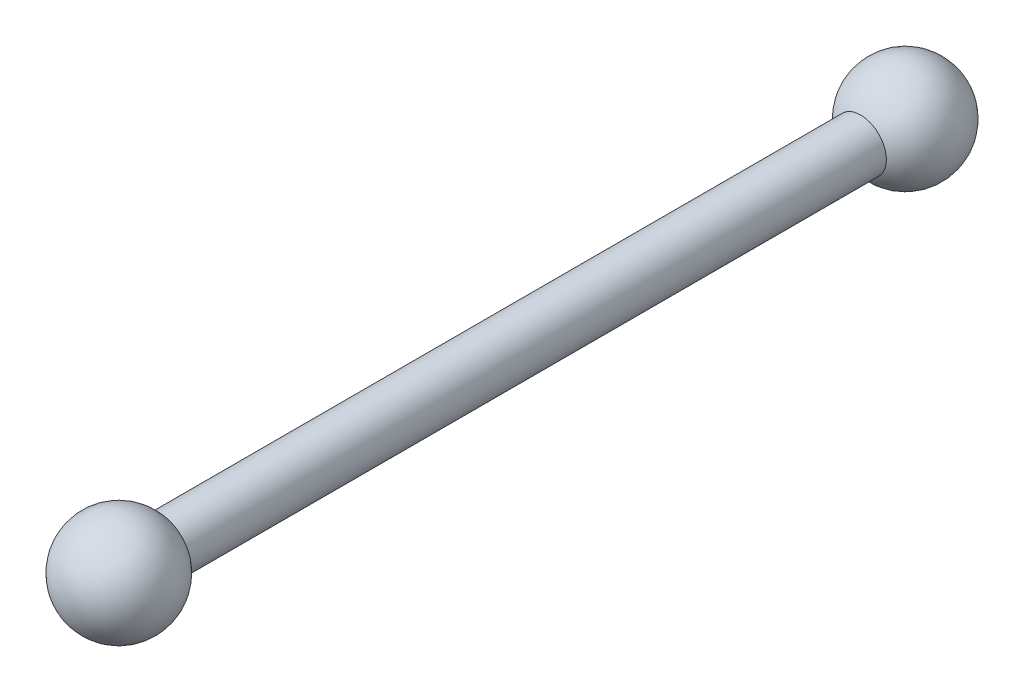
ISO-10303-21;
HEADER;
FILE_DESCRIPTION(('STEP AP214'),'2;1');
FILE_NAME('part.step','',(''),(''),'','','');
FILE_SCHEMA(('AUTOMOTIVE_DESIGN { 1 0 10303 214 1 1 1 1 }'));
ENDSEC;
DATA;
#1=APPLICATION_CONTEXT('core data for automotive mechanical design processes');
#2=APPLICATION_PROTOCOL_DEFINITION('international standard','automotive_design',2000,#1);
#3=PRODUCT_CONTEXT('',#1,'mechanical');
#4=PRODUCT('Part','Part','',(#3));
#5=PRODUCT_RELATED_PRODUCT_CATEGORY('part','',(#4));
#6=PRODUCT_DEFINITION_FORMATION('','',#4);
#7=PRODUCT_DEFINITION_CONTEXT('part definition',#1,'design');
#8=PRODUCT_DEFINITION('design','',#6,#7);
#9=PRODUCT_DEFINITION_SHAPE('','',#8);
#10=(LENGTH_UNIT() NAMED_UNIT(*) SI_UNIT(.MILLI.,.METRE.));
#11=(NAMED_UNIT(*) PLANE_ANGLE_UNIT() SI_UNIT($,.RADIAN.));
#12=(NAMED_UNIT(*) SI_UNIT($,.STERADIAN.) SOLID_ANGLE_UNIT());
#13=UNCERTAINTY_MEASURE_WITH_UNIT(LENGTH_MEASURE(1.E-05),#10,'distance_accuracy_value','');
#14=(GEOMETRIC_REPRESENTATION_CONTEXT(3) GLOBAL_UNCERTAINTY_ASSIGNED_CONTEXT((#13)) GLOBAL_UNIT_ASSIGNED_CONTEXT((#10,
#11,#12)) REPRESENTATION_CONTEXT('',''));
#15=CARTESIAN_POINT('',(0.,0.,0.));
#16=DIRECTION('',(0.,0.,1.));
#17=DIRECTION('',(1.,0.,0.));
#18=AXIS2_PLACEMENT_3D('',#15,#16,#17);
#19=CARTESIAN_POINT('',(0.,0.,-58.));
#20=DIRECTION('',(0.,1.,0.));
#21=DIRECTION('',(1.,0.,0.));
#22=AXIS2_PLACEMENT_3D('',#19,#20,#21);
#23=SPHERICAL_SURFACE('',#22,4.);
#24=CARTESIAN_POINT('',(0.,0.,-58.));
#25=DIRECTION('',(0.,0.,-1.));
#26=DIRECTION('',(-1.,0.,0.));
#27=AXIS2_PLACEMENT_3D('',#24,#25,#26);
#28=SPHERICAL_SURFACE('',#27,4.);
#29=CARTESIAN_POINT('',(0.,0.,-54.5358983848622));
#30=DIRECTION('',(0.,0.,-1.));
#31=DIRECTION('',(-1.,0.,0.));
#32=AXIS2_PLACEMENT_3D('',#29,#30,#31);
#33=CIRCLE('',#32,2.);
#34=CARTESIAN_POINT('',(-2.,0.,-54.5358983848622));
#35=VERTEX_POINT('',#34);
#36=EDGE_CURVE('E46',#35,#35,#33,.F.);
#37=ORIENTED_EDGE('',*,*,#36,.F.);
#38=EDGE_LOOP('',(#37));
#39=FACE_BOUND('',#38,.T.);
#40=ADVANCED_FACE('F42',(#39),#28,.T.);
#41=CARTESIAN_POINT('',(0.,0.,-55.));
#42=DIRECTION('',(0.,0.,1.));
#43=DIRECTION('',(1.,0.,0.));
#44=AXIS2_PLACEMENT_3D('',#41,#42,#43);
#45=CYLINDRICAL_SURFACE('',#44,2.);
#46=CARTESIAN_POINT('',(0.,0.,-0.464101615137752));
#47=DIRECTION('',(0.,0.,1.));
#48=DIRECTION('',(1.,0.,0.));
#49=AXIS2_PLACEMENT_3D('',#46,#47,#48);
#50=CIRCLE('',#49,2.);
#51=CARTESIAN_POINT('',(2.,0.,-0.464101615137752));
#52=VERTEX_POINT('',#51);
#53=EDGE_CURVE('E12',#52,#52,#50,.F.);
#54=ORIENTED_EDGE('',*,*,#53,.T.);
#55=EDGE_LOOP('',(#54));
#56=FACE_BOUND('',#55,.T.);
#57=ORIENTED_EDGE('',*,*,#36,.T.);
#58=EDGE_LOOP('',(#57));
#59=FACE_BOUND('',#58,.T.);
#60=ADVANCED_FACE('F44',(#56,#59),#45,.T.);
#61=CARTESIAN_POINT('',(0.,0.,3.));
#62=DIRECTION('',(0.,1.,0.));
#63=DIRECTION('',(1.,0.,0.));
#64=AXIS2_PLACEMENT_3D('',#61,#62,#63);
#65=SPHERICAL_SURFACE('',#64,4.);
#66=CARTESIAN_POINT('',(0.,0.,3.));
#67=DIRECTION('',(0.,0.,1.));
#68=DIRECTION('',(1.,0.,0.));
#69=AXIS2_PLACEMENT_3D('',#66,#67,#68);
#70=SPHERICAL_SURFACE('',#69,4.);
#71=ORIENTED_EDGE('',*,*,#53,.F.);
#72=EDGE_LOOP('',(#71));
#73=FACE_BOUND('',#72,.T.);
#74=ADVANCED_FACE('F61',(#73),#70,.T.);
#75=CLOSED_SHELL('',(#40,#60,#74));
#76=MANIFOLD_SOLID_BREP('B2',#75);
#77=ADVANCED_BREP_SHAPE_REPRESENTATION('',(#18,#76),#14);
#78=SHAPE_DEFINITION_REPRESENTATION(#9,#77);
ENDSEC;
END-ISO-10303-21;
